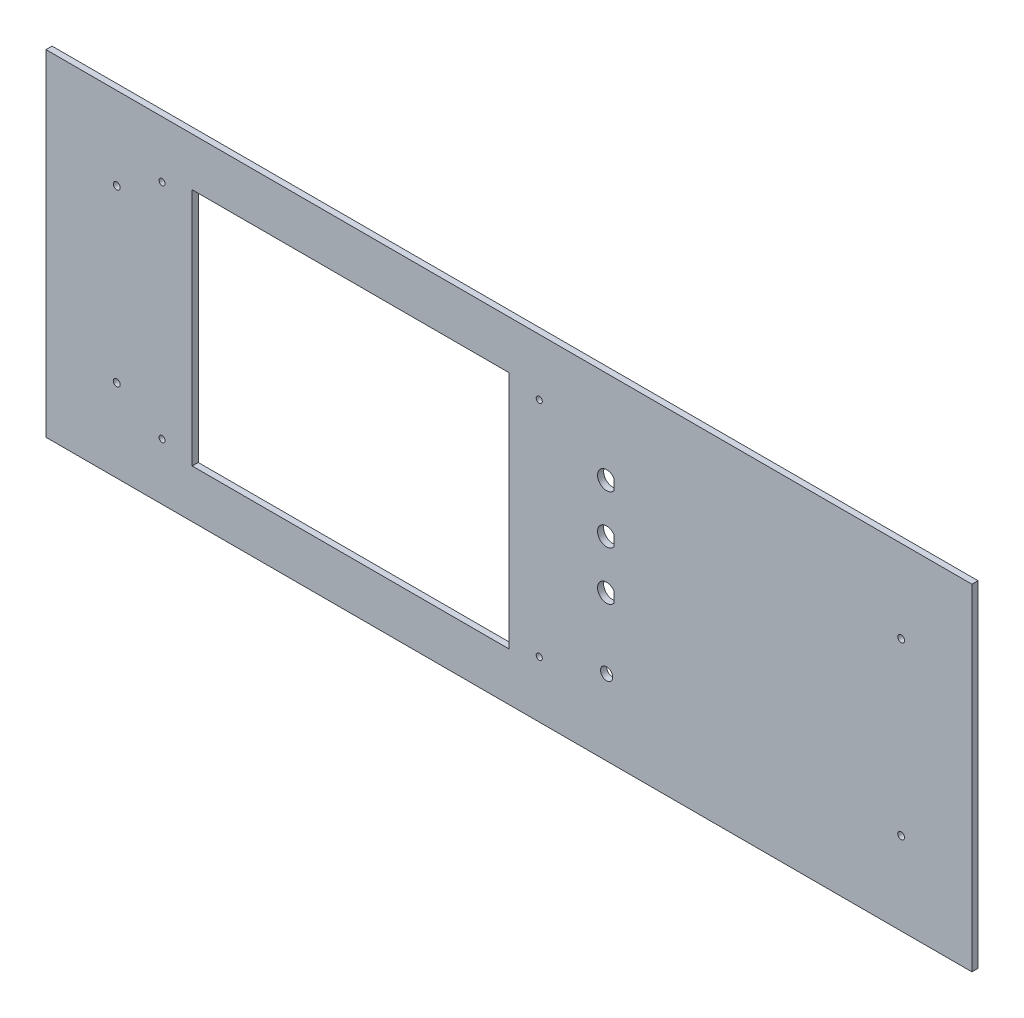
ISO-10303-21;
HEADER;
FILE_DESCRIPTION(('STEP AP214'),'2;1');
FILE_NAME('part.step','',(''),(''),'','','');
FILE_SCHEMA(('AUTOMOTIVE_DESIGN { 1 0 10303 214 1 1 1 1 }'));
ENDSEC;
DATA;
#1=APPLICATION_CONTEXT('core data for automotive mechanical design processes');
#2=APPLICATION_PROTOCOL_DEFINITION('international standard','automotive_design',2000,#1);
#3=PRODUCT_CONTEXT('',#1,'mechanical');
#4=PRODUCT('Part','Part','',(#3));
#5=PRODUCT_RELATED_PRODUCT_CATEGORY('part','',(#4));
#6=PRODUCT_DEFINITION_FORMATION('','',#4);
#7=PRODUCT_DEFINITION_CONTEXT('part definition',#1,'design');
#8=PRODUCT_DEFINITION('design','',#6,#7);
#9=PRODUCT_DEFINITION_SHAPE('','',#8);
#10=(LENGTH_UNIT() NAMED_UNIT(*) SI_UNIT(.MILLI.,.METRE.));
#11=(NAMED_UNIT(*) PLANE_ANGLE_UNIT() SI_UNIT($,.RADIAN.));
#12=(NAMED_UNIT(*) SI_UNIT($,.STERADIAN.) SOLID_ANGLE_UNIT());
#13=UNCERTAINTY_MEASURE_WITH_UNIT(LENGTH_MEASURE(1.E-05),#10,'distance_accuracy_value','');
#14=(GEOMETRIC_REPRESENTATION_CONTEXT(3) GLOBAL_UNCERTAINTY_ASSIGNED_CONTEXT((#13)) GLOBAL_UNIT_ASSIGNED_CONTEXT((#10,
#11,#12)) REPRESENTATION_CONTEXT('',''));
#15=CARTESIAN_POINT('',(0.,0.,0.));
#16=DIRECTION('',(0.,0.,1.));
#17=DIRECTION('',(1.,0.,0.));
#18=AXIS2_PLACEMENT_3D('',#15,#16,#17);
#19=CARTESIAN_POINT('',(0.,175.006,3.175));
#20=DIRECTION('',(0.,0.,-1.));
#21=DIRECTION('',(-1.,0.,0.));
#22=AXIS2_PLACEMENT_3D('',#19,#20,#21);
#23=PLANE('',#22);
#24=CARTESIAN_POINT('',(36.8808,131.953,3.175));
#25=DIRECTION('',(0.,0.,1.));
#26=DIRECTION('',(1.,0.,0.));
#27=AXIS2_PLACEMENT_3D('',#24,#25,#26);
#28=CIRCLE('',#27,1.77799999999999);
#29=CARTESIAN_POINT('',(38.6588,131.953,3.175));
#30=VERTEX_POINT('',#29);
#31=EDGE_CURVE('E282',#30,#30,#28,.T.);
#32=ORIENTED_EDGE('',*,*,#31,.F.);
#33=EDGE_LOOP('',(#32));
#34=FACE_BOUND('',#33,.T.);
#35=CARTESIAN_POINT('',(36.8808,43.053,3.175));
#36=DIRECTION('',(0.,0.,1.));
#37=DIRECTION('',(1.,0.,0.));
#38=AXIS2_PLACEMENT_3D('',#35,#36,#37);
#39=CIRCLE('',#38,1.77799999999999);
#40=CARTESIAN_POINT('',(38.6588,43.053,3.175));
#41=VERTEX_POINT('',#40);
#42=EDGE_CURVE('E278',#41,#41,#39,.T.);
#43=ORIENTED_EDGE('',*,*,#42,.F.);
#44=EDGE_LOOP('',(#43));
#45=FACE_BOUND('',#44,.T.);
#46=CARTESIAN_POINT('',(292.2016,39.3827,3.175));
#47=DIRECTION('',(0.,0.,1.));
#48=DIRECTION('',(1.,0.,0.));
#49=AXIS2_PLACEMENT_3D('',#46,#47,#48);
#50=CIRCLE('',#49,3.17499999999997);
#51=CARTESIAN_POINT('',(295.3766,39.3827,3.175));
#52=VERTEX_POINT('',#51);
#53=EDGE_CURVE('E274',#52,#52,#50,.T.);
#54=ORIENTED_EDGE('',*,*,#53,.F.);
#55=EDGE_LOOP('',(#54));
#56=FACE_BOUND('',#55,.T.);
#57=DIRECTION('',(0.,1.,0.));
#58=VECTOR('',#57,1.);
#59=CARTESIAN_POINT('',(296.1513,98.7433632492162,3.175));
#60=LINE('',#59,#58);
#61=CARTESIAN_POINT('',(296.1513,98.7433632492162,3.175));
#62=VERTEX_POINT('',#61);
#63=CARTESIAN_POINT('',(296.1513,103.974036750784,3.175));
#64=VERTEX_POINT('',#63);
#65=EDGE_CURVE('E136',#62,#64,#60,.T.);
#66=ORIENTED_EDGE('',*,*,#65,.F.);
#67=CARTESIAN_POINT('',(292.2016,101.3587,3.175));
#68=DIRECTION('',(0.,0.,1.));
#69=DIRECTION('',(1.,0.,0.));
#70=AXIS2_PLACEMENT_3D('',#67,#68,#69);
#71=CIRCLE('',#70,4.73710000000001);
#72=EDGE_CURVE('E150',#64,#62,#71,.T.);
#73=ORIENTED_EDGE('',*,*,#72,.F.);
#74=EDGE_LOOP('',(#66,#73));
#75=FACE_BOUND('',#74,.T.);
#76=DIRECTION('',(0.,1.,0.));
#77=VECTOR('',#76,1.);
#78=CARTESIAN_POINT('',(296.1513,73.3433632492162,3.175));
#79=LINE('',#78,#77);
#80=CARTESIAN_POINT('',(296.1513,73.3433632492162,3.175));
#81=VERTEX_POINT('',#80);
#82=CARTESIAN_POINT('',(296.1513,78.5740367507839,3.175));
#83=VERTEX_POINT('',#82);
#84=EDGE_CURVE('E161',#81,#83,#79,.T.);
#85=ORIENTED_EDGE('',*,*,#84,.F.);
#86=CARTESIAN_POINT('',(292.2016,75.9587,3.175));
#87=DIRECTION('',(0.,0.,1.));
#88=DIRECTION('',(1.,0.,0.));
#89=AXIS2_PLACEMENT_3D('',#86,#87,#88);
#90=CIRCLE('',#89,4.73710000000001);
#91=EDGE_CURVE('E156',#83,#81,#90,.T.);
#92=ORIENTED_EDGE('',*,*,#91,.F.);
#93=EDGE_LOOP('',(#85,#92));
#94=FACE_BOUND('',#93,.T.);
#95=CARTESIAN_POINT('',(257.0988,145.5039,3.175));
#96=DIRECTION('',(0.,0.,1.));
#97=DIRECTION('',(1.,0.,0.));
#98=AXIS2_PLACEMENT_3D('',#95,#96,#97);
#99=CIRCLE('',#98,1.58750000000002);
#100=CARTESIAN_POINT('',(258.6863,145.5039,3.175));
#101=VERTEX_POINT('',#100);
#102=EDGE_CURVE('E178',#101,#101,#99,.T.);
#103=ORIENTED_EDGE('',*,*,#102,.F.);
#104=EDGE_LOOP('',(#103));
#105=FACE_BOUND('',#104,.T.);
#106=DIRECTION('',(0.,-1.,0.));
#107=VECTOR('',#106,1.);
#108=CARTESIAN_POINT('',(0.,0.,3.175));
#109=LINE('',#108,#107);
#110=CARTESIAN_POINT('',(0.,175.006,3.175));
#111=VERTEX_POINT('',#110);
#112=CARTESIAN_POINT('',(0.,0.,3.175));
#113=VERTEX_POINT('',#112);
#114=EDGE_CURVE('E240',#111,#113,#109,.T.);
#115=ORIENTED_EDGE('',*,*,#114,.T.);
#116=DIRECTION('',(1.,0.,0.));
#117=VECTOR('',#116,1.);
#118=CARTESIAN_POINT('',(0.,0.,3.175));
#119=LINE('',#118,#117);
#120=CARTESIAN_POINT('',(482.6,0.,3.175));
#121=VERTEX_POINT('',#120);
#122=EDGE_CURVE('E243',#113,#121,#119,.T.);
#123=ORIENTED_EDGE('',*,*,#122,.T.);
#124=DIRECTION('',(0.,1.,0.));
#125=VECTOR('',#124,1.);
#126=CARTESIAN_POINT('',(482.6,0.,3.175));
#127=LINE('',#126,#125);
#128=CARTESIAN_POINT('',(482.6,175.006,3.175));
#129=VERTEX_POINT('',#128);
#130=EDGE_CURVE('E245',#121,#129,#127,.T.);
#131=ORIENTED_EDGE('',*,*,#130,.T.);
#132=DIRECTION('',(-1.,0.,0.));
#133=VECTOR('',#132,1.);
#134=CARTESIAN_POINT('',(0.,175.006,3.175));
#135=LINE('',#134,#133);
#136=EDGE_CURVE('E247',#129,#111,#135,.T.);
#137=ORIENTED_EDGE('',*,*,#136,.T.);
#138=EDGE_LOOP('',(#115,#123,#131,#137));
#139=FACE_BOUND('',#138,.T.);
#140=DIRECTION('',(1.,0.,0.));
#141=VECTOR('',#140,1.);
#142=CARTESIAN_POINT('',(76.2,25.1587,3.175));
#143=LINE('',#142,#141);
#144=CARTESIAN_POINT('',(76.2,25.1587,3.175));
#145=VERTEX_POINT('',#144);
#146=CARTESIAN_POINT('',(241.4016,25.1587,3.175));
#147=VERTEX_POINT('',#146);
#148=EDGE_CURVE('E201',#145,#147,#143,.T.);
#149=ORIENTED_EDGE('',*,*,#148,.F.);
#150=DIRECTION('',(0.,-1.,0.));
#151=VECTOR('',#150,1.);
#152=CARTESIAN_POINT('',(76.2,149.8473,3.175));
#153=LINE('',#152,#151);
#154=CARTESIAN_POINT('',(76.2,149.8473,3.175));
#155=VERTEX_POINT('',#154);
#156=EDGE_CURVE('E199',#155,#145,#153,.T.);
#157=ORIENTED_EDGE('',*,*,#156,.F.);
#158=DIRECTION('',(-1.,0.,0.));
#159=VECTOR('',#158,1.);
#160=CARTESIAN_POINT('',(76.2,149.8473,3.175));
#161=LINE('',#160,#159);
#162=CARTESIAN_POINT('',(241.4016,149.8473,3.175));
#163=VERTEX_POINT('',#162);
#164=EDGE_CURVE('E207',#163,#155,#161,.T.);
#165=ORIENTED_EDGE('',*,*,#164,.F.);
#166=DIRECTION('',(0.,1.,0.));
#167=VECTOR('',#166,1.);
#168=CARTESIAN_POINT('',(241.4016,149.8473,3.175));
#169=LINE('',#168,#167);
#170=EDGE_CURVE('E204',#147,#163,#169,.T.);
#171=ORIENTED_EDGE('',*,*,#170,.F.);
#172=EDGE_LOOP('',(#149,#157,#165,#171));
#173=FACE_BOUND('',#172,.T.);
#174=CARTESIAN_POINT('',(60.5028,29.5021,3.175));
#175=DIRECTION('',(0.,0.,1.));
#176=DIRECTION('',(1.,0.,0.));
#177=AXIS2_PLACEMENT_3D('',#174,#175,#176);
#178=CIRCLE('',#177,1.5875);
#179=CARTESIAN_POINT('',(62.0903,29.5021,3.175));
#180=VERTEX_POINT('',#179);
#181=EDGE_CURVE('E196',#180,#180,#178,.T.);
#182=ORIENTED_EDGE('',*,*,#181,.F.);
#183=EDGE_LOOP('',(#182));
#184=FACE_BOUND('',#183,.T.);
#185=CARTESIAN_POINT('',(257.0988,29.5021,3.175));
#186=DIRECTION('',(0.,0.,1.));
#187=DIRECTION('',(1.,0.,0.));
#188=AXIS2_PLACEMENT_3D('',#185,#186,#187);
#189=CIRCLE('',#188,1.58750000000002);
#190=CARTESIAN_POINT('',(258.6863,29.5021,3.175));
#191=VERTEX_POINT('',#190);
#192=EDGE_CURVE('E190',#191,#191,#189,.T.);
#193=ORIENTED_EDGE('',*,*,#192,.F.);
#194=EDGE_LOOP('',(#193));
#195=FACE_BOUND('',#194,.T.);
#196=CARTESIAN_POINT('',(60.5028,145.5039,3.175));
#197=DIRECTION('',(0.,0.,1.));
#198=DIRECTION('',(1.,0.,0.));
#199=AXIS2_PLACEMENT_3D('',#196,#197,#198);
#200=CIRCLE('',#199,1.5875);
#201=CARTESIAN_POINT('',(62.0903,145.5039,3.175));
#202=VERTEX_POINT('',#201);
#203=EDGE_CURVE('E184',#202,#202,#200,.T.);
#204=ORIENTED_EDGE('',*,*,#203,.F.);
#205=EDGE_LOOP('',(#204));
#206=FACE_BOUND('',#205,.T.);
#207=CARTESIAN_POINT('',(292.2016,126.7587,3.175));
#208=DIRECTION('',(0.,0.,1.));
#209=DIRECTION('',(1.,0.,0.));
#210=AXIS2_PLACEMENT_3D('',#207,#208,#209);
#211=CIRCLE('',#210,4.73710000000001);
#212=CARTESIAN_POINT('',(296.1513,129.374036750784,3.175));
#213=VERTEX_POINT('',#212);
#214=CARTESIAN_POINT('',(296.1513,124.143363249216,3.175));
#215=VERTEX_POINT('',#214);
#216=EDGE_CURVE('E261',#213,#215,#211,.T.);
#217=ORIENTED_EDGE('',*,*,#216,.F.);
#218=DIRECTION('',(0.,1.,0.));
#219=VECTOR('',#218,1.);
#220=CARTESIAN_POINT('',(296.1513,124.143363249216,3.175));
#221=LINE('',#220,#219);
#222=EDGE_CURVE('E263',#215,#213,#221,.T.);
#223=ORIENTED_EDGE('',*,*,#222,.F.);
#224=EDGE_LOOP('',(#217,#223));
#225=FACE_BOUND('',#224,.T.);
#226=CARTESIAN_POINT('',(445.7192,43.053,3.175));
#227=DIRECTION('',(0.,0.,1.));
#228=DIRECTION('',(1.,0.,0.));
#229=AXIS2_PLACEMENT_3D('',#226,#227,#228);
#230=CIRCLE('',#229,1.778);
#231=CARTESIAN_POINT('',(447.4972,43.053,3.175));
#232=VERTEX_POINT('',#231);
#233=EDGE_CURVE('E289',#232,#232,#230,.T.);
#234=ORIENTED_EDGE('',*,*,#233,.F.);
#235=EDGE_LOOP('',(#234));
#236=FACE_BOUND('',#235,.T.);
#237=CARTESIAN_POINT('',(445.7192,131.953,3.175));
#238=DIRECTION('',(0.,0.,1.));
#239=DIRECTION('',(1.,0.,0.));
#240=AXIS2_PLACEMENT_3D('',#237,#238,#239);
#241=CIRCLE('',#240,1.778);
#242=CARTESIAN_POINT('',(447.4972,131.953,3.175));
#243=VERTEX_POINT('',#242);
#244=EDGE_CURVE('E359',#243,#243,#241,.T.);
#245=ORIENTED_EDGE('',*,*,#244,.F.);
#246=EDGE_LOOP('',(#245));
#247=FACE_BOUND('',#246,.T.);
#248=ADVANCED_FACE('F34',(#34,#45,#56,#75,#94,#105,#139,#173,#184,#195,#206,#225,#236,#247),#23,.F.);
#249=CARTESIAN_POINT('',(0.,175.006,0.));
#250=DIRECTION('',(0.,0.,-1.));
#251=DIRECTION('',(-1.,0.,0.));
#252=AXIS2_PLACEMENT_3D('',#249,#250,#251);
#253=PLANE('',#252);
#254=CARTESIAN_POINT('',(445.7192,131.953,0.));
#255=DIRECTION('',(0.,0.,-1.));
#256=DIRECTION('',(-1.,0.,0.));
#257=AXIS2_PLACEMENT_3D('',#254,#255,#256);
#258=CIRCLE('',#257,1.69345460229659);
#259=CARTESIAN_POINT('',(444.025745397703,131.953,0.));
#260=VERTEX_POINT('',#259);
#261=EDGE_CURVE('E38',#260,#260,#258,.T.);
#262=ORIENTED_EDGE('',*,*,#261,.F.);
#263=EDGE_LOOP('',(#262));
#264=FACE_BOUND('',#263,.T.);
#265=CARTESIAN_POINT('',(445.7192,43.053,0.));
#266=DIRECTION('',(0.,0.,-1.));
#267=DIRECTION('',(-1.,0.,0.));
#268=AXIS2_PLACEMENT_3D('',#265,#266,#267);
#269=CIRCLE('',#268,1.69345460229659);
#270=CARTESIAN_POINT('',(444.025745397703,43.053,0.));
#271=VERTEX_POINT('',#270);
#272=EDGE_CURVE('E280',#271,#271,#269,.T.);
#273=ORIENTED_EDGE('',*,*,#272,.F.);
#274=EDGE_LOOP('',(#273));
#275=FACE_BOUND('',#274,.T.);
#276=CARTESIAN_POINT('',(36.8808,131.953,0.));
#277=DIRECTION('',(0.,0.,-1.));
#278=DIRECTION('',(-1.,0.,0.));
#279=AXIS2_PLACEMENT_3D('',#276,#277,#278);
#280=CIRCLE('',#279,1.69345460229657);
#281=CARTESIAN_POINT('',(35.1873453977034,131.953,0.));
#282=VERTEX_POINT('',#281);
#283=EDGE_CURVE('E276',#282,#282,#280,.T.);
#284=ORIENTED_EDGE('',*,*,#283,.F.);
#285=EDGE_LOOP('',(#284));
#286=FACE_BOUND('',#285,.T.);
#287=CARTESIAN_POINT('',(36.8808,43.053,0.));
#288=DIRECTION('',(0.,0.,-1.));
#289=DIRECTION('',(-1.,0.,0.));
#290=AXIS2_PLACEMENT_3D('',#287,#288,#289);
#291=CIRCLE('',#290,1.69345460229657);
#292=CARTESIAN_POINT('',(35.1873453977034,43.053,0.));
#293=VERTEX_POINT('',#292);
#294=EDGE_CURVE('E271',#293,#293,#291,.T.);
#295=ORIENTED_EDGE('',*,*,#294,.F.);
#296=EDGE_LOOP('',(#295));
#297=FACE_BOUND('',#296,.T.);
#298=CARTESIAN_POINT('',(292.2016,39.3827,0.));
#299=DIRECTION('',(0.,0.,1.));
#300=DIRECTION('',(1.,0.,0.));
#301=AXIS2_PLACEMENT_3D('',#298,#299,#300);
#302=CIRCLE('',#301,3.17499999999997);
#303=CARTESIAN_POINT('',(295.3766,39.3827,0.));
#304=VERTEX_POINT('',#303);
#305=EDGE_CURVE('E146',#304,#304,#302,.T.);
#306=ORIENTED_EDGE('',*,*,#305,.T.);
#307=EDGE_LOOP('',(#306));
#308=FACE_BOUND('',#307,.T.);
#309=CARTESIAN_POINT('',(292.2016,101.3587,0.));
#310=DIRECTION('',(0.,0.,1.));
#311=DIRECTION('',(1.,0.,0.));
#312=AXIS2_PLACEMENT_3D('',#309,#310,#311);
#313=CIRCLE('',#312,4.73710000000001);
#314=CARTESIAN_POINT('',(296.1513,103.974036750784,0.));
#315=VERTEX_POINT('',#314);
#316=CARTESIAN_POINT('',(296.1513,98.7433632492162,0.));
#317=VERTEX_POINT('',#316);
#318=EDGE_CURVE('E152',#315,#317,#313,.T.);
#319=ORIENTED_EDGE('',*,*,#318,.T.);
#320=DIRECTION('',(0.,1.,0.));
#321=VECTOR('',#320,1.);
#322=CARTESIAN_POINT('',(296.1513,98.7433632492162,0.));
#323=LINE('',#322,#321);
#324=EDGE_CURVE('E145',#317,#315,#323,.T.);
#325=ORIENTED_EDGE('',*,*,#324,.T.);
#326=EDGE_LOOP('',(#319,#325));
#327=FACE_BOUND('',#326,.T.);
#328=CARTESIAN_POINT('',(292.2016,75.9587,0.));
#329=DIRECTION('',(0.,0.,1.));
#330=DIRECTION('',(1.,0.,0.));
#331=AXIS2_PLACEMENT_3D('',#328,#329,#330);
#332=CIRCLE('',#331,4.73710000000001);
#333=CARTESIAN_POINT('',(296.1513,78.5740367507839,0.));
#334=VERTEX_POINT('',#333);
#335=CARTESIAN_POINT('',(296.1513,73.3433632492162,0.));
#336=VERTEX_POINT('',#335);
#337=EDGE_CURVE('E164',#334,#336,#332,.T.);
#338=ORIENTED_EDGE('',*,*,#337,.T.);
#339=DIRECTION('',(0.,1.,0.));
#340=VECTOR('',#339,1.);
#341=CARTESIAN_POINT('',(296.1513,73.3433632492162,0.));
#342=LINE('',#341,#340);
#343=EDGE_CURVE('E167',#336,#334,#342,.T.);
#344=ORIENTED_EDGE('',*,*,#343,.T.);
#345=EDGE_LOOP('',(#338,#344));
#346=FACE_BOUND('',#345,.T.);
#347=CARTESIAN_POINT('',(257.0988,29.5021,0.));
#348=DIRECTION('',(0.,0.,1.));
#349=DIRECTION('',(1.,0.,0.));
#350=AXIS2_PLACEMENT_3D('',#347,#348,#349);
#351=CIRCLE('',#350,1.58750000000002);
#352=CARTESIAN_POINT('',(258.6863,29.5021,0.));
#353=VERTEX_POINT('',#352);
#354=EDGE_CURVE('E187',#353,#353,#351,.T.);
#355=ORIENTED_EDGE('',*,*,#354,.T.);
#356=EDGE_LOOP('',(#355));
#357=FACE_BOUND('',#356,.T.);
#358=CARTESIAN_POINT('',(60.5028,29.5021,0.));
#359=DIRECTION('',(0.,0.,1.));
#360=DIRECTION('',(1.,0.,0.));
#361=AXIS2_PLACEMENT_3D('',#358,#359,#360);
#362=CIRCLE('',#361,1.5875);
#363=CARTESIAN_POINT('',(62.0903,29.5021,0.));
#364=VERTEX_POINT('',#363);
#365=EDGE_CURVE('E193',#364,#364,#362,.T.);
#366=ORIENTED_EDGE('',*,*,#365,.T.);
#367=EDGE_LOOP('',(#366));
#368=FACE_BOUND('',#367,.T.);
#369=DIRECTION('',(0.,-1.,0.));
#370=VECTOR('',#369,1.);
#371=CARTESIAN_POINT('',(76.2,149.8473,0.));
#372=LINE('',#371,#370);
#373=CARTESIAN_POINT('',(76.2,149.8473,0.));
#374=VERTEX_POINT('',#373);
#375=CARTESIAN_POINT('',(76.2,25.1587,0.));
#376=VERTEX_POINT('',#375);
#377=EDGE_CURVE('E210',#374,#376,#372,.T.);
#378=ORIENTED_EDGE('',*,*,#377,.T.);
#379=DIRECTION('',(1.,0.,0.));
#380=VECTOR('',#379,1.);
#381=CARTESIAN_POINT('',(76.2,25.1587,0.));
#382=LINE('',#381,#380);
#383=CARTESIAN_POINT('',(241.4016,25.1587,0.));
#384=VERTEX_POINT('',#383);
#385=EDGE_CURVE('E213',#376,#384,#382,.T.);
#386=ORIENTED_EDGE('',*,*,#385,.T.);
#387=DIRECTION('',(0.,1.,0.));
#388=VECTOR('',#387,1.);
#389=CARTESIAN_POINT('',(241.4016,149.8473,0.));
#390=LINE('',#389,#388);
#391=CARTESIAN_POINT('',(241.4016,149.8473,0.));
#392=VERTEX_POINT('',#391);
#393=EDGE_CURVE('E216',#384,#392,#390,.T.);
#394=ORIENTED_EDGE('',*,*,#393,.T.);
#395=DIRECTION('',(-1.,0.,0.));
#396=VECTOR('',#395,1.);
#397=CARTESIAN_POINT('',(76.2,149.8473,0.));
#398=LINE('',#397,#396);
#399=EDGE_CURVE('E219',#392,#374,#398,.T.);
#400=ORIENTED_EDGE('',*,*,#399,.T.);
#401=EDGE_LOOP('',(#378,#386,#394,#400));
#402=FACE_BOUND('',#401,.T.);
#403=DIRECTION('',(0.,-1.,0.));
#404=VECTOR('',#403,1.);
#405=CARTESIAN_POINT('',(0.,0.,0.));
#406=LINE('',#405,#404);
#407=CARTESIAN_POINT('',(0.,175.006,0.));
#408=VERTEX_POINT('',#407);
#409=CARTESIAN_POINT('',(0.,0.,0.));
#410=VERTEX_POINT('',#409);
#411=EDGE_CURVE('E225',#408,#410,#406,.T.);
#412=ORIENTED_EDGE('',*,*,#411,.F.);
#413=DIRECTION('',(-1.,0.,0.));
#414=VECTOR('',#413,1.);
#415=CARTESIAN_POINT('',(0.,175.006,0.));
#416=LINE('',#415,#414);
#417=CARTESIAN_POINT('',(482.6,175.006,0.));
#418=VERTEX_POINT('',#417);
#419=EDGE_CURVE('E238',#418,#408,#416,.T.);
#420=ORIENTED_EDGE('',*,*,#419,.F.);
#421=DIRECTION('',(0.,1.,0.));
#422=VECTOR('',#421,1.);
#423=CARTESIAN_POINT('',(482.6,0.,0.));
#424=LINE('',#423,#422);
#425=CARTESIAN_POINT('',(482.6,0.,0.));
#426=VERTEX_POINT('',#425);
#427=EDGE_CURVE('E236',#426,#418,#424,.T.);
#428=ORIENTED_EDGE('',*,*,#427,.F.);
#429=DIRECTION('',(1.,0.,0.));
#430=VECTOR('',#429,1.);
#431=CARTESIAN_POINT('',(0.,0.,0.));
#432=LINE('',#431,#430);
#433=EDGE_CURVE('E234',#410,#426,#432,.T.);
#434=ORIENTED_EDGE('',*,*,#433,.F.);
#435=EDGE_LOOP('',(#412,#420,#428,#434));
#436=FACE_BOUND('',#435,.T.);
#437=CARTESIAN_POINT('',(60.5028,145.5039,0.));
#438=DIRECTION('',(0.,0.,1.));
#439=DIRECTION('',(1.,0.,0.));
#440=AXIS2_PLACEMENT_3D('',#437,#438,#439);
#441=CIRCLE('',#440,1.5875);
#442=CARTESIAN_POINT('',(62.0903,145.5039,0.));
#443=VERTEX_POINT('',#442);
#444=EDGE_CURVE('E181',#443,#443,#441,.T.);
#445=ORIENTED_EDGE('',*,*,#444,.T.);
#446=EDGE_LOOP('',(#445));
#447=FACE_BOUND('',#446,.T.);
#448=CARTESIAN_POINT('',(257.0988,145.5039,0.));
#449=DIRECTION('',(0.,0.,1.));
#450=DIRECTION('',(1.,0.,0.));
#451=AXIS2_PLACEMENT_3D('',#448,#449,#450);
#452=CIRCLE('',#451,1.58750000000002);
#453=CARTESIAN_POINT('',(258.6863,145.5039,0.));
#454=VERTEX_POINT('',#453);
#455=EDGE_CURVE('E173',#454,#454,#452,.T.);
#456=ORIENTED_EDGE('',*,*,#455,.T.);
#457=EDGE_LOOP('',(#456));
#458=FACE_BOUND('',#457,.T.);
#459=CARTESIAN_POINT('',(292.2016,126.7587,0.));
#460=DIRECTION('',(0.,0.,1.));
#461=DIRECTION('',(1.,0.,0.));
#462=AXIS2_PLACEMENT_3D('',#459,#460,#461);
#463=CIRCLE('',#462,4.73710000000001);
#464=CARTESIAN_POINT('',(296.1513,129.374036750784,0.));
#465=VERTEX_POINT('',#464);
#466=CARTESIAN_POINT('',(296.1513,124.143363249216,0.));
#467=VERTEX_POINT('',#466);
#468=EDGE_CURVE('E50',#465,#467,#463,.T.);
#469=ORIENTED_EDGE('',*,*,#468,.T.);
#470=DIRECTION('',(0.,1.,0.));
#471=VECTOR('',#470,1.);
#472=CARTESIAN_POINT('',(296.1513,124.143363249216,0.));
#473=LINE('',#472,#471);
#474=EDGE_CURVE('E267',#467,#465,#473,.T.);
#475=ORIENTED_EDGE('',*,*,#474,.T.);
#476=EDGE_LOOP('',(#469,#475));
#477=FACE_BOUND('',#476,.T.);
#478=ADVANCED_FACE('F308',(#264,#275,#286,#297,#308,#327,#346,#357,#368,#402,#436,#447,#458,
#477),#253,.T.);
#479=CARTESIAN_POINT('',(0.,0.,3.175));
#480=DIRECTION('',(1.,0.,0.));
#481=DIRECTION('',(0.,0.,-1.));
#482=AXIS2_PLACEMENT_3D('',#479,#480,#481);
#483=PLANE('',#482);
#484=ORIENTED_EDGE('',*,*,#411,.T.);
#485=DIRECTION('',(0.,0.,-1.));
#486=VECTOR('',#485,1.);
#487=CARTESIAN_POINT('',(0.,0.,3.175));
#488=LINE('',#487,#486);
#489=EDGE_CURVE('E258',#113,#410,#488,.T.);
#490=ORIENTED_EDGE('',*,*,#489,.F.);
#491=ORIENTED_EDGE('',*,*,#114,.F.);
#492=DIRECTION('',(0.,0.,-1.));
#493=VECTOR('',#492,1.);
#494=CARTESIAN_POINT('',(0.,175.006,3.175));
#495=LINE('',#494,#493);
#496=EDGE_CURVE('E249',#111,#408,#495,.T.);
#497=ORIENTED_EDGE('',*,*,#496,.T.);
#498=EDGE_LOOP('',(#484,#490,#491,#497));
#499=FACE_BOUND('',#498,.T.);
#500=ADVANCED_FACE('F311',(#499),#483,.F.);
#501=CARTESIAN_POINT('',(0.,0.,3.175));
#502=DIRECTION('',(0.,1.,0.));
#503=DIRECTION('',(0.,0.,1.));
#504=AXIS2_PLACEMENT_3D('',#501,#502,#503);
#505=PLANE('',#504);
#506=ORIENTED_EDGE('',*,*,#433,.T.);
#507=DIRECTION('',(0.,0.,-1.));
#508=VECTOR('',#507,1.);
#509=CARTESIAN_POINT('',(482.6,0.,3.175));
#510=LINE('',#509,#508);
#511=EDGE_CURVE('E255',#121,#426,#510,.T.);
#512=ORIENTED_EDGE('',*,*,#511,.F.);
#513=ORIENTED_EDGE('',*,*,#122,.F.);
#514=ORIENTED_EDGE('',*,*,#489,.T.);
#515=EDGE_LOOP('',(#506,#512,#513,#514));
#516=FACE_BOUND('',#515,.T.);
#517=ADVANCED_FACE('F440',(#516),#505,.F.);
#518=CARTESIAN_POINT('',(482.6,0.,3.175));
#519=DIRECTION('',(-1.,0.,0.));
#520=DIRECTION('',(0.,0.,1.));
#521=AXIS2_PLACEMENT_3D('',#518,#519,#520);
#522=PLANE('',#521);
#523=ORIENTED_EDGE('',*,*,#427,.T.);
#524=DIRECTION('',(0.,0.,-1.));
#525=VECTOR('',#524,1.);
#526=CARTESIAN_POINT('',(482.6,175.006,3.175));
#527=LINE('',#526,#525);
#528=EDGE_CURVE('E252',#129,#418,#527,.T.);
#529=ORIENTED_EDGE('',*,*,#528,.F.);
#530=ORIENTED_EDGE('',*,*,#130,.F.);
#531=ORIENTED_EDGE('',*,*,#511,.T.);
#532=EDGE_LOOP('',(#523,#529,#530,#531));
#533=FACE_BOUND('',#532,.T.);
#534=ADVANCED_FACE('F436',(#533),#522,.F.);
#535=CARTESIAN_POINT('',(0.,175.006,3.175));
#536=DIRECTION('',(0.,-1.,0.));
#537=DIRECTION('',(0.,0.,-1.));
#538=AXIS2_PLACEMENT_3D('',#535,#536,#537);
#539=PLANE('',#538);
#540=ORIENTED_EDGE('',*,*,#419,.T.);
#541=ORIENTED_EDGE('',*,*,#496,.F.);
#542=ORIENTED_EDGE('',*,*,#136,.F.);
#543=ORIENTED_EDGE('',*,*,#528,.T.);
#544=EDGE_LOOP('',(#540,#541,#542,#543));
#545=FACE_BOUND('',#544,.T.);
#546=ADVANCED_FACE('F431',(#545),#539,.F.);
#547=CARTESIAN_POINT('',(76.2,149.8473,0.));
#548=DIRECTION('',(-1.,0.,0.));
#549=DIRECTION('',(0.,-1.,0.));
#550=AXIS2_PLACEMENT_3D('',#547,#548,#549);
#551=PLANE('',#550);
#552=ORIENTED_EDGE('',*,*,#156,.T.);
#553=DIRECTION('',(0.,0.,1.));
#554=VECTOR('',#553,1.);
#555=CARTESIAN_POINT('',(76.2,25.1587,0.));
#556=LINE('',#555,#554);
#557=EDGE_CURVE('E222',#376,#145,#556,.T.);
#558=ORIENTED_EDGE('',*,*,#557,.F.);
#559=ORIENTED_EDGE('',*,*,#377,.F.);
#560=DIRECTION('',(0.,0.,1.));
#561=VECTOR('',#560,1.);
#562=CARTESIAN_POINT('',(76.2,149.8473,0.));
#563=LINE('',#562,#561);
#564=EDGE_CURVE('E223',#374,#155,#563,.T.);
#565=ORIENTED_EDGE('',*,*,#564,.T.);
#566=EDGE_LOOP('',(#552,#558,#559,#565));
#567=FACE_BOUND('',#566,.T.);
#568=ADVANCED_FACE('F422',(#567),#551,.F.);
#569=CARTESIAN_POINT('',(76.2,149.8473,0.));
#570=DIRECTION('',(0.,1.,0.));
#571=DIRECTION('',(-1.,0.,0.));
#572=AXIS2_PLACEMENT_3D('',#569,#570,#571);
#573=PLANE('',#572);
#574=ORIENTED_EDGE('',*,*,#164,.T.);
#575=ORIENTED_EDGE('',*,*,#564,.F.);
#576=ORIENTED_EDGE('',*,*,#399,.F.);
#577=DIRECTION('',(0.,0.,1.));
#578=VECTOR('',#577,1.);
#579=CARTESIAN_POINT('',(241.4016,149.8473,0.));
#580=LINE('',#579,#578);
#581=EDGE_CURVE('E226',#392,#163,#580,.T.);
#582=ORIENTED_EDGE('',*,*,#581,.T.);
#583=EDGE_LOOP('',(#574,#575,#576,#582));
#584=FACE_BOUND('',#583,.T.);
#585=ADVANCED_FACE('F418',(#584),#573,.F.);
#586=CARTESIAN_POINT('',(241.4016,149.8473,0.));
#587=DIRECTION('',(1.,0.,0.));
#588=DIRECTION('',(0.,1.,0.));
#589=AXIS2_PLACEMENT_3D('',#586,#587,#588);
#590=PLANE('',#589);
#591=ORIENTED_EDGE('',*,*,#170,.T.);
#592=ORIENTED_EDGE('',*,*,#581,.F.);
#593=ORIENTED_EDGE('',*,*,#393,.F.);
#594=DIRECTION('',(0.,0.,1.));
#595=VECTOR('',#594,1.);
#596=CARTESIAN_POINT('',(241.4016,25.1587,0.));
#597=LINE('',#596,#595);
#598=EDGE_CURVE('E228',#384,#147,#597,.T.);
#599=ORIENTED_EDGE('',*,*,#598,.T.);
#600=EDGE_LOOP('',(#591,#592,#593,#599));
#601=FACE_BOUND('',#600,.T.);
#602=ADVANCED_FACE('F421',(#601),#590,.F.);
#603=CARTESIAN_POINT('',(76.2,25.1587,0.));
#604=DIRECTION('',(0.,-1.,0.));
#605=DIRECTION('',(0.,0.,-1.));
#606=AXIS2_PLACEMENT_3D('',#603,#604,#605);
#607=PLANE('',#606);
#608=ORIENTED_EDGE('',*,*,#148,.T.);
#609=ORIENTED_EDGE('',*,*,#598,.F.);
#610=ORIENTED_EDGE('',*,*,#385,.F.);
#611=ORIENTED_EDGE('',*,*,#557,.T.);
#612=EDGE_LOOP('',(#608,#609,#610,#611));
#613=FACE_BOUND('',#612,.T.);
#614=ADVANCED_FACE('F416',(#613),#607,.F.);
#615=CARTESIAN_POINT('',(60.5028,29.5021,3.175));
#616=DIRECTION('',(0.,0.,1.));
#617=DIRECTION('',(1.,0.,0.));
#618=AXIS2_PLACEMENT_3D('',#615,#616,#617);
#619=CYLINDRICAL_SURFACE('',#618,1.5875);
#620=ORIENTED_EDGE('',*,*,#365,.F.);
#621=EDGE_LOOP('',(#620));
#622=FACE_BOUND('',#621,.T.);
#623=ORIENTED_EDGE('',*,*,#181,.T.);
#624=EDGE_LOOP('',(#623));
#625=FACE_BOUND('',#624,.T.);
#626=ADVANCED_FACE('F412',(#622,#625),#619,.F.);
#627=CARTESIAN_POINT('',(257.0988,29.5021,3.175));
#628=DIRECTION('',(0.,0.,1.));
#629=DIRECTION('',(1.,0.,0.));
#630=AXIS2_PLACEMENT_3D('',#627,#628,#629);
#631=CYLINDRICAL_SURFACE('',#630,1.58750000000002);
#632=ORIENTED_EDGE('',*,*,#354,.F.);
#633=EDGE_LOOP('',(#632));
#634=FACE_BOUND('',#633,.T.);
#635=ORIENTED_EDGE('',*,*,#192,.T.);
#636=EDGE_LOOP('',(#635));
#637=FACE_BOUND('',#636,.T.);
#638=ADVANCED_FACE('F408',(#634,#637),#631,.F.);
#639=CARTESIAN_POINT('',(60.5028,145.5039,3.175));
#640=DIRECTION('',(0.,0.,1.));
#641=DIRECTION('',(1.,0.,0.));
#642=AXIS2_PLACEMENT_3D('',#639,#640,#641);
#643=CYLINDRICAL_SURFACE('',#642,1.5875);
#644=ORIENTED_EDGE('',*,*,#444,.F.);
#645=EDGE_LOOP('',(#644));
#646=FACE_BOUND('',#645,.T.);
#647=ORIENTED_EDGE('',*,*,#203,.T.);
#648=EDGE_LOOP('',(#647));
#649=FACE_BOUND('',#648,.T.);
#650=ADVANCED_FACE('F332',(#646,#649),#643,.F.);
#651=CARTESIAN_POINT('',(257.0988,145.5039,3.175));
#652=DIRECTION('',(0.,0.,1.));
#653=DIRECTION('',(1.,0.,0.));
#654=AXIS2_PLACEMENT_3D('',#651,#652,#653);
#655=CYLINDRICAL_SURFACE('',#654,1.58750000000002);
#656=ORIENTED_EDGE('',*,*,#455,.F.);
#657=EDGE_LOOP('',(#656));
#658=FACE_BOUND('',#657,.T.);
#659=ORIENTED_EDGE('',*,*,#102,.T.);
#660=EDGE_LOOP('',(#659));
#661=FACE_BOUND('',#660,.T.);
#662=ADVANCED_FACE('F328',(#658,#661),#655,.F.);
#663=CARTESIAN_POINT('',(292.2016,75.9587,0.));
#664=DIRECTION('',(0.,0.,1.));
#665=DIRECTION('',(1.,0.,0.));
#666=AXIS2_PLACEMENT_3D('',#663,#664,#665);
#667=CYLINDRICAL_SURFACE('',#666,4.73710000000001);
#668=ORIENTED_EDGE('',*,*,#91,.T.);
#669=DIRECTION('',(0.,0.,1.));
#670=VECTOR('',#669,1.);
#671=CARTESIAN_POINT('',(296.1513,73.3433632492162,0.));
#672=LINE('',#671,#670);
#673=EDGE_CURVE('E170',#336,#81,#672,.T.);
#674=ORIENTED_EDGE('',*,*,#673,.F.);
#675=ORIENTED_EDGE('',*,*,#337,.F.);
#676=DIRECTION('',(0.,0.,1.));
#677=VECTOR('',#676,1.);
#678=CARTESIAN_POINT('',(296.1513,78.5740367507839,0.));
#679=LINE('',#678,#677);
#680=EDGE_CURVE('E171',#334,#83,#679,.T.);
#681=ORIENTED_EDGE('',*,*,#680,.T.);
#682=EDGE_LOOP('',(#668,#674,#675,#681));
#683=FACE_BOUND('',#682,.T.);
#684=ADVANCED_FACE('F331',(#683),#667,.F.);
#685=CARTESIAN_POINT('',(296.1513,73.3433632492162,0.));
#686=DIRECTION('',(1.,0.,0.));
#687=DIRECTION('',(0.,0.,-1.));
#688=AXIS2_PLACEMENT_3D('',#685,#686,#687);
#689=PLANE('',#688);
#690=ORIENTED_EDGE('',*,*,#84,.T.);
#691=ORIENTED_EDGE('',*,*,#680,.F.);
#692=ORIENTED_EDGE('',*,*,#343,.F.);
#693=ORIENTED_EDGE('',*,*,#673,.T.);
#694=EDGE_LOOP('',(#690,#691,#692,#693));
#695=FACE_BOUND('',#694,.T.);
#696=ADVANCED_FACE('F397',(#695),#689,.F.);
#697=CARTESIAN_POINT('',(292.2016,101.3587,0.));
#698=DIRECTION('',(0.,0.,1.));
#699=DIRECTION('',(1.,0.,0.));
#700=AXIS2_PLACEMENT_3D('',#697,#698,#699);
#701=CYLINDRICAL_SURFACE('',#700,4.73710000000001);
#702=ORIENTED_EDGE('',*,*,#72,.T.);
#703=DIRECTION('',(0.,0.,1.));
#704=VECTOR('',#703,1.);
#705=CARTESIAN_POINT('',(296.1513,98.7433632492162,0.));
#706=LINE('',#705,#704);
#707=EDGE_CURVE('E142',#317,#62,#706,.T.);
#708=ORIENTED_EDGE('',*,*,#707,.F.);
#709=ORIENTED_EDGE('',*,*,#318,.F.);
#710=DIRECTION('',(0.,0.,1.));
#711=VECTOR('',#710,1.);
#712=CARTESIAN_POINT('',(296.1513,103.974036750784,0.));
#713=LINE('',#712,#711);
#714=EDGE_CURVE('E139',#315,#64,#713,.T.);
#715=ORIENTED_EDGE('',*,*,#714,.T.);
#716=EDGE_LOOP('',(#702,#708,#709,#715));
#717=FACE_BOUND('',#716,.T.);
#718=ADVANCED_FACE('F149',(#717),#701,.F.);
#719=CARTESIAN_POINT('',(296.1513,98.7433632492162,0.));
#720=DIRECTION('',(1.,0.,0.));
#721=DIRECTION('',(0.,0.,-1.));
#722=AXIS2_PLACEMENT_3D('',#719,#720,#721);
#723=PLANE('',#722);
#724=ORIENTED_EDGE('',*,*,#65,.T.);
#725=ORIENTED_EDGE('',*,*,#714,.F.);
#726=ORIENTED_EDGE('',*,*,#324,.F.);
#727=ORIENTED_EDGE('',*,*,#707,.T.);
#728=EDGE_LOOP('',(#724,#725,#726,#727));
#729=FACE_BOUND('',#728,.T.);
#730=ADVANCED_FACE('F138',(#729),#723,.F.);
#731=CARTESIAN_POINT('',(296.1513,124.143363249216,0.));
#732=DIRECTION('',(1.,0.,0.));
#733=DIRECTION('',(0.,0.,-1.));
#734=AXIS2_PLACEMENT_3D('',#731,#732,#733);
#735=PLANE('',#734);
#736=ORIENTED_EDGE('',*,*,#222,.T.);
#737=DIRECTION('',(0.,0.,1.));
#738=VECTOR('',#737,1.);
#739=CARTESIAN_POINT('',(296.1513,129.374036750784,0.));
#740=LINE('',#739,#738);
#741=EDGE_CURVE('E11',#465,#213,#740,.T.);
#742=ORIENTED_EDGE('',*,*,#741,.F.);
#743=ORIENTED_EDGE('',*,*,#474,.F.);
#744=DIRECTION('',(0.,0.,1.));
#745=VECTOR('',#744,1.);
#746=CARTESIAN_POINT('',(296.1513,124.143363249216,0.));
#747=LINE('',#746,#745);
#748=EDGE_CURVE('E43',#467,#215,#747,.T.);
#749=ORIENTED_EDGE('',*,*,#748,.T.);
#750=EDGE_LOOP('',(#736,#742,#743,#749));
#751=FACE_BOUND('',#750,.T.);
#752=ADVANCED_FACE('F36',(#751),#735,.F.);
#753=CARTESIAN_POINT('',(292.2016,126.7587,0.));
#754=DIRECTION('',(0.,0.,1.));
#755=DIRECTION('',(1.,0.,0.));
#756=AXIS2_PLACEMENT_3D('',#753,#754,#755);
#757=CYLINDRICAL_SURFACE('',#756,4.73710000000001);
#758=ORIENTED_EDGE('',*,*,#216,.T.);
#759=ORIENTED_EDGE('',*,*,#748,.F.);
#760=ORIENTED_EDGE('',*,*,#468,.F.);
#761=ORIENTED_EDGE('',*,*,#741,.T.);
#762=EDGE_LOOP('',(#758,#759,#760,#761));
#763=FACE_BOUND('',#762,.T.);
#764=ADVANCED_FACE('F382',(#763),#757,.F.);
#765=CARTESIAN_POINT('',(292.2016,39.3827,0.));
#766=DIRECTION('',(0.,0.,1.));
#767=DIRECTION('',(1.,0.,0.));
#768=AXIS2_PLACEMENT_3D('',#765,#766,#767);
#769=CYLINDRICAL_SURFACE('',#768,3.17499999999997);
#770=ORIENTED_EDGE('',*,*,#305,.F.);
#771=EDGE_LOOP('',(#770));
#772=FACE_BOUND('',#771,.T.);
#773=ORIENTED_EDGE('',*,*,#53,.T.);
#774=EDGE_LOOP('',(#773));
#775=FACE_BOUND('',#774,.T.);
#776=ADVANCED_FACE('F378',(#772,#775),#769,.F.);
#777=CARTESIAN_POINT('',(36.8808,43.053,0.0508000000000062));
#778=DIRECTION('',(0.,0.,1.));
#779=DIRECTION('',(1.,0.,0.));
#780=AXIS2_PLACEMENT_3D('',#777,#778,#779);
#781=CONICAL_SURFACE('',#780,1.77799999999999,1.02974425867665);
#782=ORIENTED_EDGE('',*,*,#294,.T.);
#783=EDGE_LOOP('',(#782));
#784=FACE_BOUND('',#783,.T.);
#785=CARTESIAN_POINT('',(36.8808,43.053,0.0508000000000062));
#786=DIRECTION('',(0.,0.,1.));
#787=DIRECTION('',(1.,0.,0.));
#788=AXIS2_PLACEMENT_3D('',#785,#786,#787);
#789=CIRCLE('',#788,1.77799999999999);
#790=CARTESIAN_POINT('',(38.6588,43.053,0.0508000000000062));
#791=VERTEX_POINT('',#790);
#792=EDGE_CURVE('E275',#791,#791,#789,.T.);
#793=ORIENTED_EDGE('',*,*,#792,.T.);
#794=EDGE_LOOP('',(#793));
#795=FACE_BOUND('',#794,.T.);
#796=ADVANCED_FACE('F381',(#784,#795),#781,.F.);
#797=CARTESIAN_POINT('',(36.8808,43.053,3.175));
#798=DIRECTION('',(0.,0.,1.));
#799=DIRECTION('',(1.,0.,0.));
#800=AXIS2_PLACEMENT_3D('',#797,#798,#799);
#801=CYLINDRICAL_SURFACE('',#800,1.77799999999999);
#802=ORIENTED_EDGE('',*,*,#792,.F.);
#803=EDGE_LOOP('',(#802));
#804=FACE_BOUND('',#803,.T.);
#805=ORIENTED_EDGE('',*,*,#42,.T.);
#806=EDGE_LOOP('',(#805));
#807=FACE_BOUND('',#806,.T.);
#808=ADVANCED_FACE('F390',(#804,#807),#801,.F.);
#809=CARTESIAN_POINT('',(36.8808,131.953,0.0508000000000062));
#810=DIRECTION('',(0.,0.,1.));
#811=DIRECTION('',(1.,0.,0.));
#812=AXIS2_PLACEMENT_3D('',#809,#810,#811);
#813=CONICAL_SURFACE('',#812,1.77799999999999,1.02974425867665);
#814=ORIENTED_EDGE('',*,*,#283,.T.);
#815=EDGE_LOOP('',(#814));
#816=FACE_BOUND('',#815,.T.);
#817=CARTESIAN_POINT('',(36.8808,131.953,0.0508000000000062));
#818=DIRECTION('',(0.,0.,1.));
#819=DIRECTION('',(1.,0.,0.));
#820=AXIS2_PLACEMENT_3D('',#817,#818,#819);
#821=CIRCLE('',#820,1.77799999999999);
#822=CARTESIAN_POINT('',(38.6588,131.953,0.0508000000000062));
#823=VERTEX_POINT('',#822);
#824=EDGE_CURVE('E279',#823,#823,#821,.T.);
#825=ORIENTED_EDGE('',*,*,#824,.T.);
#826=EDGE_LOOP('',(#825));
#827=FACE_BOUND('',#826,.T.);
#828=ADVANCED_FACE('F548',(#816,#827),#813,.F.);
#829=CARTESIAN_POINT('',(36.8808,131.953,3.175));
#830=DIRECTION('',(0.,0.,1.));
#831=DIRECTION('',(1.,0.,0.));
#832=AXIS2_PLACEMENT_3D('',#829,#830,#831);
#833=CYLINDRICAL_SURFACE('',#832,1.77799999999999);
#834=ORIENTED_EDGE('',*,*,#824,.F.);
#835=EDGE_LOOP('',(#834));
#836=FACE_BOUND('',#835,.T.);
#837=ORIENTED_EDGE('',*,*,#31,.T.);
#838=EDGE_LOOP('',(#837));
#839=FACE_BOUND('',#838,.T.);
#840=ADVANCED_FACE('F568',(#836,#839),#833,.F.);
#841=CARTESIAN_POINT('',(445.7192,43.053,0.0508000000000062));
#842=DIRECTION('',(0.,0.,1.));
#843=DIRECTION('',(1.,0.,0.));
#844=AXIS2_PLACEMENT_3D('',#841,#842,#843);
#845=CONICAL_SURFACE('',#844,1.778,1.02974425867665);
#846=ORIENTED_EDGE('',*,*,#272,.T.);
#847=EDGE_LOOP('',(#846));
#848=FACE_BOUND('',#847,.T.);
#849=CARTESIAN_POINT('',(445.7192,43.053,0.0508000000000062));
#850=DIRECTION('',(0.,0.,1.));
#851=DIRECTION('',(1.,0.,0.));
#852=AXIS2_PLACEMENT_3D('',#849,#850,#851);
#853=CIRCLE('',#852,1.778);
#854=CARTESIAN_POINT('',(447.4972,43.053,0.0508000000000062));
#855=VERTEX_POINT('',#854);
#856=EDGE_CURVE('E283',#855,#855,#853,.T.);
#857=ORIENTED_EDGE('',*,*,#856,.T.);
#858=EDGE_LOOP('',(#857));
#859=FACE_BOUND('',#858,.T.);
#860=ADVANCED_FACE('F578',(#848,#859),#845,.F.);
#861=CARTESIAN_POINT('',(445.7192,43.053,3.175));
#862=DIRECTION('',(0.,0.,1.));
#863=DIRECTION('',(1.,0.,0.));
#864=AXIS2_PLACEMENT_3D('',#861,#862,#863);
#865=CYLINDRICAL_SURFACE('',#864,1.778);
#866=ORIENTED_EDGE('',*,*,#856,.F.);
#867=EDGE_LOOP('',(#866));
#868=FACE_BOUND('',#867,.T.);
#869=ORIENTED_EDGE('',*,*,#233,.T.);
#870=EDGE_LOOP('',(#869));
#871=FACE_BOUND('',#870,.T.);
#872=ADVANCED_FACE('F588',(#868,#871),#865,.F.);
#873=CARTESIAN_POINT('',(445.7192,131.953,0.0508000000000062));
#874=DIRECTION('',(0.,0.,1.));
#875=DIRECTION('',(1.,0.,0.));
#876=AXIS2_PLACEMENT_3D('',#873,#874,#875);
#877=CONICAL_SURFACE('',#876,1.778,1.02974425867665);
#878=ORIENTED_EDGE('',*,*,#261,.T.);
#879=EDGE_LOOP('',(#878));
#880=FACE_BOUND('',#879,.T.);
#881=CARTESIAN_POINT('',(445.7192,131.953,0.0508000000000062));
#882=DIRECTION('',(0.,0.,1.));
#883=DIRECTION('',(1.,0.,0.));
#884=AXIS2_PLACEMENT_3D('',#881,#882,#883);
#885=CIRCLE('',#884,1.778);
#886=CARTESIAN_POINT('',(447.4972,131.953,0.0508000000000062));
#887=VERTEX_POINT('',#886);
#888=EDGE_CURVE('E361',#887,#887,#885,.T.);
#889=ORIENTED_EDGE('',*,*,#888,.T.);
#890=EDGE_LOOP('',(#889));
#891=FACE_BOUND('',#890,.T.);
#892=ADVANCED_FACE('F369',(#880,#891),#877,.F.);
#893=CARTESIAN_POINT('',(445.7192,131.953,3.175));
#894=DIRECTION('',(0.,0.,1.));
#895=DIRECTION('',(1.,0.,0.));
#896=AXIS2_PLACEMENT_3D('',#893,#894,#895);
#897=CYLINDRICAL_SURFACE('',#896,1.778);
#898=ORIENTED_EDGE('',*,*,#888,.F.);
#899=EDGE_LOOP('',(#898));
#900=FACE_BOUND('',#899,.T.);
#901=ORIENTED_EDGE('',*,*,#244,.T.);
#902=EDGE_LOOP('',(#901));
#903=FACE_BOUND('',#902,.T.);
#904=ADVANCED_FACE('F606',(#900,#903),#897,.F.);
#905=CLOSED_SHELL('',(#248,#478,#500,#517,#534,#546,#568,#585,#602,#614,#626,#638,#650,#662,
#684,#696,#718,#730,#752,#764,#776,#796,#808,#828,#840,#860,#872,#892,#904));
#906=MANIFOLD_SOLID_BREP('B2',#905);
#907=ADVANCED_BREP_SHAPE_REPRESENTATION('',(#18,#906),#14);
#908=SHAPE_DEFINITION_REPRESENTATION(#9,#907);
ENDSEC;
END-ISO-10303-21;
